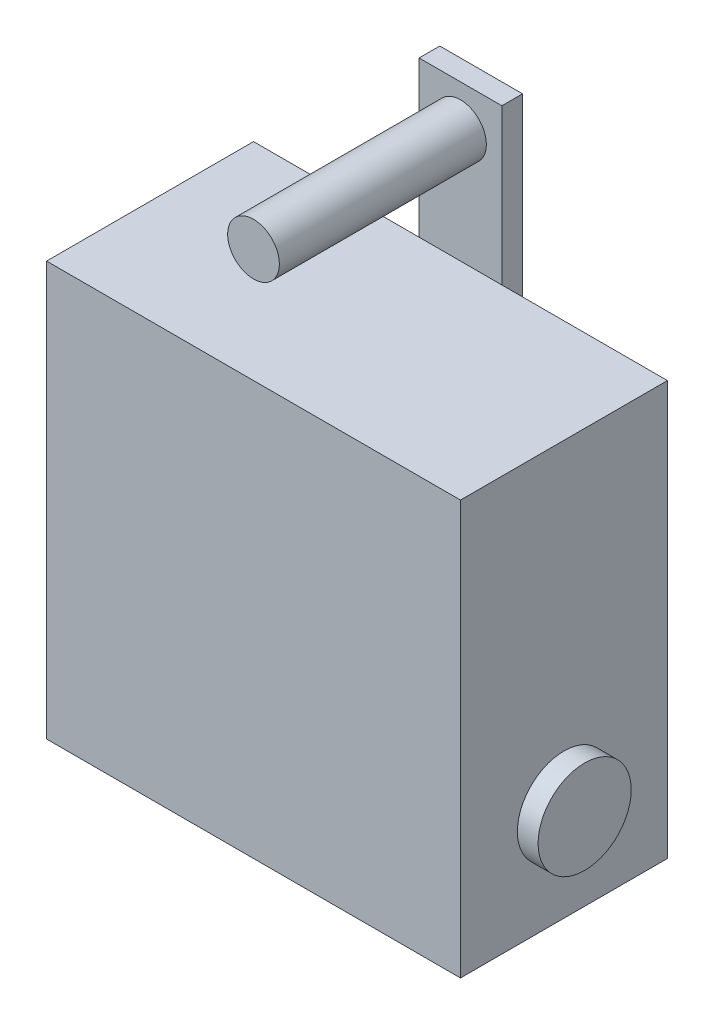
ISO-10303-21;
HEADER;
FILE_DESCRIPTION(('STEP AP214'),'2;1');
FILE_NAME('part.step','',(''),(''),'','','');
FILE_SCHEMA(('AUTOMOTIVE_DESIGN { 1 0 10303 214 1 1 1 1 }'));
ENDSEC;
DATA;
#1=APPLICATION_CONTEXT('core data for automotive mechanical design processes');
#2=APPLICATION_PROTOCOL_DEFINITION('international standard','automotive_design',2000,#1);
#3=PRODUCT_CONTEXT('',#1,'mechanical');
#4=PRODUCT('Part','Part','',(#3));
#5=PRODUCT_RELATED_PRODUCT_CATEGORY('part','',(#4));
#6=PRODUCT_DEFINITION_FORMATION('','',#4);
#7=PRODUCT_DEFINITION_CONTEXT('part definition',#1,'design');
#8=PRODUCT_DEFINITION('design','',#6,#7);
#9=PRODUCT_DEFINITION_SHAPE('','',#8);
#10=(LENGTH_UNIT() NAMED_UNIT(*) SI_UNIT(.MILLI.,.METRE.));
#11=(NAMED_UNIT(*) PLANE_ANGLE_UNIT() SI_UNIT($,.RADIAN.));
#12=(NAMED_UNIT(*) SI_UNIT($,.STERADIAN.) SOLID_ANGLE_UNIT());
#13=UNCERTAINTY_MEASURE_WITH_UNIT(LENGTH_MEASURE(1.E-05),#10,'distance_accuracy_value','');
#14=(GEOMETRIC_REPRESENTATION_CONTEXT(3) GLOBAL_UNCERTAINTY_ASSIGNED_CONTEXT((#13)) GLOBAL_UNIT_ASSIGNED_CONTEXT((#10,
#11,#12)) REPRESENTATION_CONTEXT('',''));
#15=CARTESIAN_POINT('',(0.,0.,0.));
#16=DIRECTION('',(0.,0.,1.));
#17=DIRECTION('',(1.,0.,0.));
#18=AXIS2_PLACEMENT_3D('',#15,#16,#17);
#19=CARTESIAN_POINT('',(0.,40.,-20.));
#20=DIRECTION('',(0.,0.,1.));
#21=DIRECTION('',(1.,0.,0.));
#22=AXIS2_PLACEMENT_3D('',#19,#20,#21);
#23=PLANE('',#22);
#24=DIRECTION('',(0.,-1.,0.));
#25=VECTOR('',#24,1.);
#26=CARTESIAN_POINT('',(24.,30.,-20.));
#27=LINE('',#26,#25);
#28=CARTESIAN_POINT('',(24.,40.,-20.));
#29=VERTEX_POINT('',#28);
#30=CARTESIAN_POINT('',(24.,30.,-20.));
#31=VERTEX_POINT('',#30);
#32=EDGE_CURVE('E11',#29,#31,#27,.T.);
#33=ORIENTED_EDGE('',*,*,#32,.F.);
#34=DIRECTION('',(-1.,0.,0.));
#35=VECTOR('',#34,1.);
#36=CARTESIAN_POINT('',(0.,40.,-20.));
#37=LINE('',#36,#35);
#38=CARTESIAN_POINT('',(40.,40.,-20.));
#39=VERTEX_POINT('',#38);
#40=EDGE_CURVE('E143',#39,#29,#37,.T.);
#41=ORIENTED_EDGE('',*,*,#40,.F.);
#42=DIRECTION('',(0.,-1.,0.));
#43=VECTOR('',#42,1.);
#44=CARTESIAN_POINT('',(40.,40.,-20.));
#45=LINE('',#44,#43);
#46=CARTESIAN_POINT('',(40.,0.,-20.));
#47=VERTEX_POINT('',#46);
#48=EDGE_CURVE('E157',#39,#47,#45,.T.);
#49=ORIENTED_EDGE('',*,*,#48,.T.);
#50=DIRECTION('',(-1.,0.,0.));
#51=VECTOR('',#50,1.);
#52=CARTESIAN_POINT('',(0.,0.,-20.));
#53=LINE('',#52,#51);
#54=CARTESIAN_POINT('',(0.,0.,-20.));
#55=VERTEX_POINT('',#54);
#56=EDGE_CURVE('E139',#47,#55,#53,.T.);
#57=ORIENTED_EDGE('',*,*,#56,.T.);
#58=DIRECTION('',(0.,-1.,0.));
#59=VECTOR('',#58,1.);
#60=CARTESIAN_POINT('',(0.,40.,-20.));
#61=LINE('',#60,#59);
#62=CARTESIAN_POINT('',(0.,40.,-20.));
#63=VERTEX_POINT('',#62);
#64=EDGE_CURVE('E146',#63,#55,#61,.T.);
#65=ORIENTED_EDGE('',*,*,#64,.F.);
#66=CARTESIAN_POINT('',(16.,40.,-20.));
#67=VERTEX_POINT('',#66);
#68=EDGE_CURVE('E54',#67,#63,#37,.T.);
#69=ORIENTED_EDGE('',*,*,#68,.F.);
#70=DIRECTION('',(0.,1.,0.));
#71=VECTOR('',#70,1.);
#72=CARTESIAN_POINT('',(16.,30.,-20.));
#73=LINE('',#72,#71);
#74=CARTESIAN_POINT('',(16.,30.,-20.));
#75=VERTEX_POINT('',#74);
#76=EDGE_CURVE('E200',#75,#67,#73,.T.);
#77=ORIENTED_EDGE('',*,*,#76,.F.);
#78=DIRECTION('',(-1.,0.,0.));
#79=VECTOR('',#78,1.);
#80=CARTESIAN_POINT('',(24.,30.,-20.));
#81=LINE('',#80,#79);
#82=EDGE_CURVE('E49',#31,#75,#81,.T.);
#83=ORIENTED_EDGE('',*,*,#82,.F.);
#84=EDGE_LOOP('',(#33,#41,#49,#57,#65,#69,#77,#83));
#85=FACE_BOUND('',#84,.T.);
#86=ADVANCED_FACE('F32',(#85),#23,.F.);
#87=CARTESIAN_POINT('',(0.,40.,0.));
#88=DIRECTION('',(1.,0.,0.));
#89=DIRECTION('',(0.,0.,-1.));
#90=AXIS2_PLACEMENT_3D('',#87,#88,#89);
#91=PLANE('',#90);
#92=DIRECTION('',(0.,0.,1.));
#93=VECTOR('',#92,1.);
#94=CARTESIAN_POINT('',(0.,0.,0.));
#95=LINE('',#94,#93);
#96=CARTESIAN_POINT('',(0.,0.,0.));
#97=VERTEX_POINT('',#96);
#98=EDGE_CURVE('E129',#55,#97,#95,.T.);
#99=ORIENTED_EDGE('',*,*,#98,.T.);
#100=DIRECTION('',(0.,-1.,0.));
#101=VECTOR('',#100,1.);
#102=CARTESIAN_POINT('',(0.,40.,0.));
#103=LINE('',#102,#101);
#104=CARTESIAN_POINT('',(0.,40.,0.));
#105=VERTEX_POINT('',#104);
#106=EDGE_CURVE('E162',#105,#97,#103,.T.);
#107=ORIENTED_EDGE('',*,*,#106,.F.);
#108=DIRECTION('',(0.,0.,1.));
#109=VECTOR('',#108,1.);
#110=CARTESIAN_POINT('',(0.,40.,0.));
#111=LINE('',#110,#109);
#112=EDGE_CURVE('E135',#63,#105,#111,.T.);
#113=ORIENTED_EDGE('',*,*,#112,.F.);
#114=ORIENTED_EDGE('',*,*,#64,.T.);
#115=EDGE_LOOP('',(#99,#107,#113,#114));
#116=FACE_BOUND('',#115,.T.);
#117=ADVANCED_FACE('F34',(#116),#91,.F.);
#118=CARTESIAN_POINT('',(0.,40.,0.));
#119=DIRECTION('',(0.,0.,-1.));
#120=DIRECTION('',(-1.,0.,0.));
#121=AXIS2_PLACEMENT_3D('',#118,#119,#120);
#122=PLANE('',#121);
#123=DIRECTION('',(1.,0.,0.));
#124=VECTOR('',#123,1.);
#125=CARTESIAN_POINT('',(0.,0.,0.));
#126=LINE('',#125,#124);
#127=CARTESIAN_POINT('',(40.,0.,0.));
#128=VERTEX_POINT('',#127);
#129=EDGE_CURVE('E150',#97,#128,#126,.T.);
#130=ORIENTED_EDGE('',*,*,#129,.T.);
#131=DIRECTION('',(0.,-1.,0.));
#132=VECTOR('',#131,1.);
#133=CARTESIAN_POINT('',(40.,40.,0.));
#134=LINE('',#133,#132);
#135=CARTESIAN_POINT('',(40.,40.,0.));
#136=VERTEX_POINT('',#135);
#137=EDGE_CURVE('E160',#136,#128,#134,.T.);
#138=ORIENTED_EDGE('',*,*,#137,.F.);
#139=DIRECTION('',(1.,0.,0.));
#140=VECTOR('',#139,1.);
#141=CARTESIAN_POINT('',(0.,40.,0.));
#142=LINE('',#141,#140);
#143=EDGE_CURVE('E138',#105,#136,#142,.T.);
#144=ORIENTED_EDGE('',*,*,#143,.F.);
#145=ORIENTED_EDGE('',*,*,#106,.T.);
#146=EDGE_LOOP('',(#130,#138,#144,#145));
#147=FACE_BOUND('',#146,.T.);
#148=ADVANCED_FACE('F175',(#147),#122,.F.);
#149=CARTESIAN_POINT('',(40.,40.,0.));
#150=DIRECTION('',(-1.,0.,0.));
#151=DIRECTION('',(0.,0.,1.));
#152=AXIS2_PLACEMENT_3D('',#149,#150,#151);
#153=PLANE('',#152);
#154=CARTESIAN_POINT('',(40.,9.5,-10.));
#155=DIRECTION('',(-1.,0.,0.));
#156=DIRECTION('',(0.,0.,1.));
#157=AXIS2_PLACEMENT_3D('',#154,#155,#156);
#158=CIRCLE('',#157,4.5);
#159=CARTESIAN_POINT('',(40.,9.5,-5.5));
#160=VERTEX_POINT('',#159);
#161=EDGE_CURVE('E36',#160,#160,#158,.F.);
#162=ORIENTED_EDGE('',*,*,#161,.F.);
#163=EDGE_LOOP('',(#162));
#164=FACE_BOUND('',#163,.T.);
#165=DIRECTION('',(0.,0.,-1.));
#166=VECTOR('',#165,1.);
#167=CARTESIAN_POINT('',(40.,0.,0.));
#168=LINE('',#167,#166);
#169=EDGE_CURVE('E152',#128,#47,#168,.T.);
#170=ORIENTED_EDGE('',*,*,#169,.T.);
#171=ORIENTED_EDGE('',*,*,#48,.F.);
#172=DIRECTION('',(0.,0.,-1.));
#173=VECTOR('',#172,1.);
#174=CARTESIAN_POINT('',(40.,40.,0.));
#175=LINE('',#174,#173);
#176=EDGE_CURVE('E141',#136,#39,#175,.T.);
#177=ORIENTED_EDGE('',*,*,#176,.F.);
#178=ORIENTED_EDGE('',*,*,#137,.T.);
#179=EDGE_LOOP('',(#170,#171,#177,#178));
#180=FACE_BOUND('',#179,.T.);
#181=ADVANCED_FACE('F171',(#164,#180),#153,.F.);
#182=CARTESIAN_POINT('',(0.,40.,0.));
#183=DIRECTION('',(0.,-1.,0.));
#184=DIRECTION('',(0.,0.,-1.));
#185=AXIS2_PLACEMENT_3D('',#182,#183,#184);
#186=PLANE('',#185);
#187=ORIENTED_EDGE('',*,*,#112,.T.);
#188=ORIENTED_EDGE('',*,*,#143,.T.);
#189=ORIENTED_EDGE('',*,*,#176,.T.);
#190=ORIENTED_EDGE('',*,*,#40,.T.);
#191=EDGE_CURVE('E147',#29,#67,#37,.T.);
#192=ORIENTED_EDGE('',*,*,#191,.T.);
#193=ORIENTED_EDGE('',*,*,#68,.T.);
#194=EDGE_LOOP('',(#187,#188,#189,#190,#192,#193));
#195=FACE_BOUND('',#194,.T.);
#196=ADVANCED_FACE('F174',(#195),#186,.F.);
#197=CARTESIAN_POINT('',(0.,0.,0.));
#198=DIRECTION('',(0.,-1.,0.));
#199=DIRECTION('',(0.,0.,-1.));
#200=AXIS2_PLACEMENT_3D('',#197,#198,#199);
#201=PLANE('',#200);
#202=ORIENTED_EDGE('',*,*,#98,.F.);
#203=ORIENTED_EDGE('',*,*,#56,.F.);
#204=ORIENTED_EDGE('',*,*,#169,.F.);
#205=ORIENTED_EDGE('',*,*,#129,.F.);
#206=EDGE_LOOP('',(#202,#203,#204,#205));
#207=FACE_BOUND('',#206,.T.);
#208=ADVANCED_FACE('F185',(#207),#201,.T.);
#209=CARTESIAN_POINT('',(42.,9.5,-10.));
#210=DIRECTION('',(-1.,0.,0.));
#211=DIRECTION('',(0.,0.,1.));
#212=AXIS2_PLACEMENT_3D('',#209,#210,#211);
#213=CYLINDRICAL_SURFACE('',#212,4.5);
#214=CARTESIAN_POINT('',(42.,9.5,-10.));
#215=DIRECTION('',(1.,0.,0.));
#216=DIRECTION('',(0.,0.,-1.));
#217=AXIS2_PLACEMENT_3D('',#214,#215,#216);
#218=CIRCLE('',#217,4.5);
#219=CARTESIAN_POINT('',(42.,9.5,-14.5));
#220=VERTEX_POINT('',#219);
#221=EDGE_CURVE('E126',#220,#220,#218,.T.);
#222=ORIENTED_EDGE('',*,*,#221,.F.);
#223=EDGE_LOOP('',(#222));
#224=FACE_BOUND('',#223,.T.);
#225=ORIENTED_EDGE('',*,*,#161,.T.);
#226=EDGE_LOOP('',(#225));
#227=FACE_BOUND('',#226,.T.);
#228=ADVANCED_FACE('F169',(#224,#227),#213,.T.);
#229=CARTESIAN_POINT('',(42.,9.5,-10.));
#230=DIRECTION('',(1.,0.,0.));
#231=DIRECTION('',(0.,0.,-1.));
#232=AXIS2_PLACEMENT_3D('',#229,#230,#231);
#233=PLANE('',#232);
#234=ORIENTED_EDGE('',*,*,#221,.T.);
#235=EDGE_LOOP('',(#234));
#236=FACE_BOUND('',#235,.T.);
#237=ADVANCED_FACE('F224',(#236),#233,.T.);
#238=CARTESIAN_POINT('',(0.,0.,-20.));
#239=DIRECTION('',(0.,0.,1.));
#240=DIRECTION('',(1.,0.,0.));
#241=AXIS2_PLACEMENT_3D('',#238,#239,#240);
#242=PLANE('',#241);
#243=CARTESIAN_POINT('',(20.,51.,-20.));
#244=DIRECTION('',(0.,0.,1.));
#245=DIRECTION('',(1.,0.,0.));
#246=AXIS2_PLACEMENT_3D('',#243,#244,#245);
#247=CIRCLE('',#246,2.5);
#248=CARTESIAN_POINT('',(22.5,51.,-20.));
#249=VERTEX_POINT('',#248);
#250=EDGE_CURVE('E213',#249,#249,#247,.T.);
#251=ORIENTED_EDGE('',*,*,#250,.F.);
#252=EDGE_LOOP('',(#251));
#253=FACE_BOUND('',#252,.T.);
#254=ORIENTED_EDGE('',*,*,#191,.F.);
#255=CARTESIAN_POINT('',(24.,55.,-20.));
#256=VERTEX_POINT('',#255);
#257=EDGE_CURVE('E42',#256,#29,#27,.T.);
#258=ORIENTED_EDGE('',*,*,#257,.F.);
#259=DIRECTION('',(1.,0.,0.));
#260=VECTOR('',#259,1.);
#261=CARTESIAN_POINT('',(24.,55.,-20.));
#262=LINE('',#261,#260);
#263=CARTESIAN_POINT('',(16.,55.,-20.));
#264=VERTEX_POINT('',#263);
#265=EDGE_CURVE('E122',#264,#256,#262,.T.);
#266=ORIENTED_EDGE('',*,*,#265,.F.);
#267=EDGE_CURVE('E194',#67,#264,#73,.T.);
#268=ORIENTED_EDGE('',*,*,#267,.F.);
#269=EDGE_LOOP('',(#254,#258,#266,#268));
#270=FACE_BOUND('',#269,.T.);
#271=ADVANCED_FACE('F196',(#253,#270),#242,.T.);
#272=CARTESIAN_POINT('',(24.,30.,-22.));
#273=DIRECTION('',(-1.,0.,0.));
#274=DIRECTION('',(0.,0.,1.));
#275=AXIS2_PLACEMENT_3D('',#272,#273,#274);
#276=PLANE('',#275);
#277=ORIENTED_EDGE('',*,*,#257,.T.);
#278=ORIENTED_EDGE('',*,*,#32,.T.);
#279=DIRECTION('',(0.,0.,1.));
#280=VECTOR('',#279,1.);
#281=CARTESIAN_POINT('',(24.,30.,-22.));
#282=LINE('',#281,#280);
#283=CARTESIAN_POINT('',(24.,30.,-22.));
#284=VERTEX_POINT('',#283);
#285=EDGE_CURVE('E107',#284,#31,#282,.T.);
#286=ORIENTED_EDGE('',*,*,#285,.F.);
#287=DIRECTION('',(0.,-1.,0.));
#288=VECTOR('',#287,1.);
#289=CARTESIAN_POINT('',(24.,30.,-22.));
#290=LINE('',#289,#288);
#291=CARTESIAN_POINT('',(24.,55.,-22.));
#292=VERTEX_POINT('',#291);
#293=EDGE_CURVE('E113',#292,#284,#290,.T.);
#294=ORIENTED_EDGE('',*,*,#293,.F.);
#295=DIRECTION('',(0.,0.,1.));
#296=VECTOR('',#295,1.);
#297=CARTESIAN_POINT('',(24.,55.,-22.));
#298=LINE('',#297,#296);
#299=EDGE_CURVE('E206',#292,#256,#298,.T.);
#300=ORIENTED_EDGE('',*,*,#299,.T.);
#301=EDGE_LOOP('',(#277,#278,#286,#294,#300));
#302=FACE_BOUND('',#301,.T.);
#303=ADVANCED_FACE('F125',(#302),#276,.F.);
#304=CARTESIAN_POINT('',(24.,30.,-22.));
#305=DIRECTION('',(0.,1.,0.));
#306=DIRECTION('',(-1.,0.,0.));
#307=AXIS2_PLACEMENT_3D('',#304,#305,#306);
#308=PLANE('',#307);
#309=ORIENTED_EDGE('',*,*,#82,.T.);
#310=DIRECTION('',(0.,0.,1.));
#311=VECTOR('',#310,1.);
#312=CARTESIAN_POINT('',(16.,30.,-22.));
#313=LINE('',#312,#311);
#314=CARTESIAN_POINT('',(16.,30.,-22.));
#315=VERTEX_POINT('',#314);
#316=EDGE_CURVE('E109',#315,#75,#313,.T.);
#317=ORIENTED_EDGE('',*,*,#316,.F.);
#318=DIRECTION('',(-1.,0.,0.));
#319=VECTOR('',#318,1.);
#320=CARTESIAN_POINT('',(24.,30.,-22.));
#321=LINE('',#320,#319);
#322=EDGE_CURVE('E103',#284,#315,#321,.T.);
#323=ORIENTED_EDGE('',*,*,#322,.F.);
#324=ORIENTED_EDGE('',*,*,#285,.T.);
#325=EDGE_LOOP('',(#309,#317,#323,#324));
#326=FACE_BOUND('',#325,.T.);
#327=ADVANCED_FACE('F105',(#326),#308,.F.);
#328=CARTESIAN_POINT('',(16.,30.,-22.));
#329=DIRECTION('',(1.,0.,0.));
#330=DIRECTION('',(0.,0.,-1.));
#331=AXIS2_PLACEMENT_3D('',#328,#329,#330);
#332=PLANE('',#331);
#333=ORIENTED_EDGE('',*,*,#76,.T.);
#334=ORIENTED_EDGE('',*,*,#267,.T.);
#335=DIRECTION('',(0.,0.,1.));
#336=VECTOR('',#335,1.);
#337=CARTESIAN_POINT('',(16.,55.,-22.));
#338=LINE('',#337,#336);
#339=CARTESIAN_POINT('',(16.,55.,-22.));
#340=VERTEX_POINT('',#339);
#341=EDGE_CURVE('E131',#340,#264,#338,.T.);
#342=ORIENTED_EDGE('',*,*,#341,.F.);
#343=DIRECTION('',(0.,1.,0.));
#344=VECTOR('',#343,1.);
#345=CARTESIAN_POINT('',(16.,30.,-22.));
#346=LINE('',#345,#344);
#347=EDGE_CURVE('E112',#315,#340,#346,.T.);
#348=ORIENTED_EDGE('',*,*,#347,.F.);
#349=ORIENTED_EDGE('',*,*,#316,.T.);
#350=EDGE_LOOP('',(#333,#334,#342,#348,#349));
#351=FACE_BOUND('',#350,.T.);
#352=ADVANCED_FACE('F202',(#351),#332,.F.);
#353=CARTESIAN_POINT('',(24.,55.,-22.));
#354=DIRECTION('',(0.,-1.,0.));
#355=DIRECTION('',(0.,0.,-1.));
#356=AXIS2_PLACEMENT_3D('',#353,#354,#355);
#357=PLANE('',#356);
#358=ORIENTED_EDGE('',*,*,#265,.T.);
#359=ORIENTED_EDGE('',*,*,#299,.F.);
#360=DIRECTION('',(1.,0.,0.));
#361=VECTOR('',#360,1.);
#362=CARTESIAN_POINT('',(24.,55.,-22.));
#363=LINE('',#362,#361);
#364=EDGE_CURVE('E118',#340,#292,#363,.T.);
#365=ORIENTED_EDGE('',*,*,#364,.F.);
#366=ORIENTED_EDGE('',*,*,#341,.T.);
#367=EDGE_LOOP('',(#358,#359,#365,#366));
#368=FACE_BOUND('',#367,.T.);
#369=ADVANCED_FACE('F208',(#368),#357,.F.);
#370=CARTESIAN_POINT('',(0.,0.,-22.));
#371=DIRECTION('',(0.,0.,1.));
#372=DIRECTION('',(1.,0.,0.));
#373=AXIS2_PLACEMENT_3D('',#370,#371,#372);
#374=PLANE('',#373);
#375=ORIENTED_EDGE('',*,*,#293,.T.);
#376=ORIENTED_EDGE('',*,*,#322,.T.);
#377=ORIENTED_EDGE('',*,*,#347,.T.);
#378=ORIENTED_EDGE('',*,*,#364,.T.);
#379=EDGE_LOOP('',(#375,#376,#377,#378));
#380=FACE_BOUND('',#379,.T.);
#381=ADVANCED_FACE('F116',(#380),#374,.F.);
#382=CARTESIAN_POINT('',(20.,51.,0.));
#383=DIRECTION('',(0.,0.,-1.));
#384=DIRECTION('',(-1.,0.,0.));
#385=AXIS2_PLACEMENT_3D('',#382,#383,#384);
#386=CYLINDRICAL_SURFACE('',#385,2.5);
#387=CARTESIAN_POINT('',(20.,51.,0.));
#388=DIRECTION('',(0.,0.,1.));
#389=DIRECTION('',(1.,0.,0.));
#390=AXIS2_PLACEMENT_3D('',#387,#388,#389);
#391=CIRCLE('',#390,2.5);
#392=CARTESIAN_POINT('',(22.5,51.,0.));
#393=VERTEX_POINT('',#392);
#394=EDGE_CURVE('E211',#393,#393,#391,.T.);
#395=ORIENTED_EDGE('',*,*,#394,.F.);
#396=EDGE_LOOP('',(#395));
#397=FACE_BOUND('',#396,.T.);
#398=ORIENTED_EDGE('',*,*,#250,.T.);
#399=EDGE_LOOP('',(#398));
#400=FACE_BOUND('',#399,.T.);
#401=ADVANCED_FACE('F221',(#397,#400),#386,.T.);
#402=CARTESIAN_POINT('',(20.,51.,0.));
#403=DIRECTION('',(0.,0.,1.));
#404=DIRECTION('',(1.,0.,0.));
#405=AXIS2_PLACEMENT_3D('',#402,#403,#404);
#406=PLANE('',#405);
#407=ORIENTED_EDGE('',*,*,#394,.T.);
#408=EDGE_LOOP('',(#407));
#409=FACE_BOUND('',#408,.T.);
#410=ADVANCED_FACE('F321',(#409),#406,.T.);
#411=CLOSED_SHELL('',(#86,#117,#148,#181,#196,#208,#228,#237,#271,#303,#327,#352,#369,#381,#401,#410));
#412=MANIFOLD_SOLID_BREP('B2',#411);
#413=ADVANCED_BREP_SHAPE_REPRESENTATION('',(#18,#412),#14);
#414=SHAPE_DEFINITION_REPRESENTATION(#9,#413);
ENDSEC;
END-ISO-10303-21;
